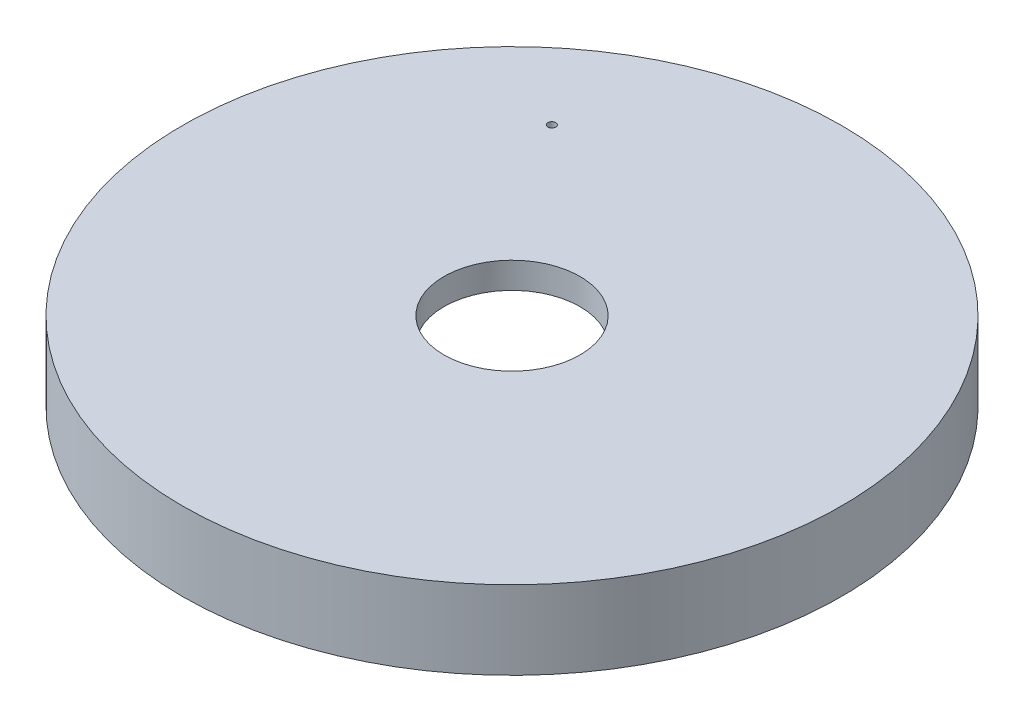
ISO-10303-21;
HEADER;
FILE_DESCRIPTION(('STEP AP214'),'2;1');
FILE_NAME('part.step','',(''),(''),'','','');
FILE_SCHEMA(('AUTOMOTIVE_DESIGN { 1 0 10303 214 1 1 1 1 }'));
ENDSEC;
DATA;
#1=APPLICATION_CONTEXT('core data for automotive mechanical design processes');
#2=APPLICATION_PROTOCOL_DEFINITION('international standard','automotive_design',2000,#1);
#3=PRODUCT_CONTEXT('',#1,'mechanical');
#4=PRODUCT('Part','Part','',(#3));
#5=PRODUCT_RELATED_PRODUCT_CATEGORY('part','',(#4));
#6=PRODUCT_DEFINITION_FORMATION('','',#4);
#7=PRODUCT_DEFINITION_CONTEXT('part definition',#1,'design');
#8=PRODUCT_DEFINITION('design','',#6,#7);
#9=PRODUCT_DEFINITION_SHAPE('','',#8);
#10=(LENGTH_UNIT() NAMED_UNIT(*) SI_UNIT(.MILLI.,.METRE.));
#11=(NAMED_UNIT(*) PLANE_ANGLE_UNIT() SI_UNIT($,.RADIAN.));
#12=(NAMED_UNIT(*) SI_UNIT($,.STERADIAN.) SOLID_ANGLE_UNIT());
#13=UNCERTAINTY_MEASURE_WITH_UNIT(LENGTH_MEASURE(1.E-05),#10,'distance_accuracy_value','');
#14=(GEOMETRIC_REPRESENTATION_CONTEXT(3) GLOBAL_UNCERTAINTY_ASSIGNED_CONTEXT((#13)) GLOBAL_UNIT_ASSIGNED_CONTEXT((#10,
#11,#12)) REPRESENTATION_CONTEXT('',''));
#15=CARTESIAN_POINT('',(0.,0.,0.));
#16=DIRECTION('',(0.,0.,1.));
#17=DIRECTION('',(1.,0.,0.));
#18=AXIS2_PLACEMENT_3D('',#15,#16,#17);
#19=CARTESIAN_POINT('',(0.,24.6083363009322,0.));
#20=DIRECTION('',(0.,1.,0.));
#21=DIRECTION('',(0.,0.,1.));
#22=AXIS2_PLACEMENT_3D('',#19,#20,#21);
#23=CYLINDRICAL_SURFACE('',#22,13.);
#24=CARTESIAN_POINT('',(0.,-2.5,0.));
#25=DIRECTION('',(0.,1.,0.));
#26=DIRECTION('',(0.,0.,1.));
#27=AXIS2_PLACEMENT_3D('',#24,#25,#26);
#28=CIRCLE('',#27,13.);
#29=CARTESIAN_POINT('',(0.,-2.5,-13.));
#30=VERTEX_POINT('',#29);
#31=EDGE_CURVE('E62',#30,#30,#28,.T.);
#32=ORIENTED_EDGE('',*,*,#31,.F.);
#33=EDGE_LOOP('',(#32));
#34=FACE_BOUND('',#33,.T.);
#35=CARTESIAN_POINT('',(0.,2.5,0.));
#36=DIRECTION('',(0.,1.,0.));
#37=DIRECTION('',(0.,0.,1.));
#38=AXIS2_PLACEMENT_3D('',#35,#36,#37);
#39=CIRCLE('',#38,13.);
#40=CARTESIAN_POINT('',(0.,2.5,13.));
#41=VERTEX_POINT('',#40);
#42=EDGE_CURVE('E10',#41,#41,#39,.T.);
#43=ORIENTED_EDGE('',*,*,#42,.T.);
#44=EDGE_LOOP('',(#43));
#45=FACE_BOUND('',#44,.T.);
#46=ADVANCED_FACE('F43',(#34,#45),#23,.F.);
#47=CARTESIAN_POINT('',(13.,2.5,0.));
#48=DIRECTION('',(0.,-1.,0.));
#49=DIRECTION('',(0.,0.,-1.));
#50=AXIS2_PLACEMENT_3D('',#47,#48,#49);
#51=PLANE('',#50);
#52=CARTESIAN_POINT('',(-27.7859608156295,2.5,-35.3968979086063));
#53=DIRECTION('',(0.,-1.,0.));
#54=DIRECTION('',(0.,0.,-1.));
#55=AXIS2_PLACEMENT_3D('',#52,#53,#54);
#56=CIRCLE('',#55,0.750000000000002);
#57=CARTESIAN_POINT('',(-27.7859608156295,2.5,-36.1468979086063));
#58=VERTEX_POINT('',#57);
#59=EDGE_CURVE('E65',#58,#58,#56,.T.);
#60=ORIENTED_EDGE('',*,*,#59,.T.);
#61=EDGE_LOOP('',(#60));
#62=FACE_BOUND('',#61,.T.);
#63=ORIENTED_EDGE('',*,*,#42,.F.);
#64=EDGE_LOOP('',(#63));
#65=FACE_BOUND('',#64,.T.);
#66=CARTESIAN_POINT('',(0.,2.5,0.));
#67=DIRECTION('',(0.,1.,0.));
#68=DIRECTION('',(0.,0.,1.));
#69=AXIS2_PLACEMENT_3D('',#66,#67,#68);
#70=CIRCLE('',#69,63.);
#71=CARTESIAN_POINT('',(0.,2.5,63.));
#72=VERTEX_POINT('',#71);
#73=EDGE_CURVE('E50',#72,#72,#70,.T.);
#74=ORIENTED_EDGE('',*,*,#73,.T.);
#75=EDGE_LOOP('',(#74));
#76=FACE_BOUND('',#75,.T.);
#77=ADVANCED_FACE('F87',(#62,#65,#76),#51,.F.);
#78=CARTESIAN_POINT('',(0.,24.6083363009322,0.));
#79=DIRECTION('',(0.,1.,0.));
#80=DIRECTION('',(0.,0.,1.));
#81=AXIS2_PLACEMENT_3D('',#78,#79,#80);
#82=CYLINDRICAL_SURFACE('',#81,63.);
#83=ORIENTED_EDGE('',*,*,#73,.F.);
#84=EDGE_LOOP('',(#83));
#85=FACE_BOUND('',#84,.T.);
#86=CARTESIAN_POINT('',(0.,-12.5,0.));
#87=DIRECTION('',(0.,1.,0.));
#88=DIRECTION('',(0.,0.,1.));
#89=AXIS2_PLACEMENT_3D('',#86,#87,#88);
#90=CIRCLE('',#89,63.);
#91=CARTESIAN_POINT('',(0.,-12.5,63.));
#92=VERTEX_POINT('',#91);
#93=EDGE_CURVE('E54',#92,#92,#90,.T.);
#94=ORIENTED_EDGE('',*,*,#93,.T.);
#95=EDGE_LOOP('',(#94));
#96=FACE_BOUND('',#95,.T.);
#97=ADVANCED_FACE('F92',(#85,#96),#82,.T.);
#98=CARTESIAN_POINT('',(63.,-12.5,0.));
#99=DIRECTION('',(0.,1.,0.));
#100=DIRECTION('',(0.,0.,1.));
#101=AXIS2_PLACEMENT_3D('',#98,#99,#100);
#102=PLANE('',#101);
#103=CARTESIAN_POINT('',(-27.7859608156295,-12.5,-35.3968979086063));
#104=DIRECTION('',(0.,1.,0.));
#105=DIRECTION('',(0.,0.,1.));
#106=AXIS2_PLACEMENT_3D('',#103,#104,#105);
#107=CIRCLE('',#106,0.750000000000002);
#108=CARTESIAN_POINT('',(-27.7859608156295,-12.5,-34.6468979086063));
#109=VERTEX_POINT('',#108);
#110=EDGE_CURVE('E46',#109,#109,#107,.T.);
#111=ORIENTED_EDGE('',*,*,#110,.T.);
#112=EDGE_LOOP('',(#111));
#113=FACE_BOUND('',#112,.T.);
#114=ORIENTED_EDGE('',*,*,#93,.F.);
#115=EDGE_LOOP('',(#114));
#116=FACE_BOUND('',#115,.T.);
#117=CARTESIAN_POINT('',(0.,-12.5,0.));
#118=DIRECTION('',(0.,1.,0.));
#119=DIRECTION('',(0.,0.,1.));
#120=AXIS2_PLACEMENT_3D('',#117,#118,#119);
#121=CIRCLE('',#120,40.4747741945462);
#122=CARTESIAN_POINT('',(0.,-12.5,-40.4747741945462));
#123=VERTEX_POINT('',#122);
#124=EDGE_CURVE('E59',#123,#123,#121,.T.);
#125=ORIENTED_EDGE('',*,*,#124,.T.);
#126=EDGE_LOOP('',(#125));
#127=FACE_BOUND('',#126,.T.);
#128=ADVANCED_FACE('F72',(#113,#116,#127),#102,.F.);
#129=CARTESIAN_POINT('',(0.,-2.5,0.));
#130=DIRECTION('',(0.,-1.,0.));
#131=DIRECTION('',(0.,0.,-1.));
#132=AXIS2_PLACEMENT_3D('',#129,#130,#131);
#133=CONICAL_SURFACE('',#132,13.,1.22173047639603);
#134=CARTESIAN_POINT('',(0.,-12.5,-40.4747741945462));
#135=CARTESIAN_POINT('',(0.,-12.3958333333333,-40.1885786300196));
#136=CARTESIAN_POINT('',(0.,-12.2916666666667,-39.9023830654931));
#137=CARTESIAN_POINT('',(0.,-12.0833333333333,-39.3299919364401));
#138=CARTESIAN_POINT('',(0.,-11.9791666666667,-39.0437963719136));
#139=CARTESIAN_POINT('',(0.,-11.7708333333333,-38.4714052428605));
#140=CARTESIAN_POINT('',(0.,-11.6666666666667,-38.185209678334));
#141=CARTESIAN_POINT('',(0.,-11.4583333333333,-37.6128185492809));
#142=CARTESIAN_POINT('',(0.,-11.3541666666667,-37.3266229847544));
#143=CARTESIAN_POINT('',(0.,-11.1458333333333,-36.7542318557014));
#144=CARTESIAN_POINT('',(0.,-11.0416666666667,-36.4680362911748));
#145=CARTESIAN_POINT('',(0.,-10.8333333333333,-35.8956451621218));
#146=CARTESIAN_POINT('',(0.,-10.7291666666667,-35.6094495975953));
#147=CARTESIAN_POINT('',(0.,-10.5208333333333,-35.0370584685422));
#148=CARTESIAN_POINT('',(0.,-10.4166666666667,-34.7508629040157));
#149=CARTESIAN_POINT('',(0.,-10.2083333333333,-34.1784717749627));
#150=CARTESIAN_POINT('',(0.,-10.1041666666667,-33.8922762104361));
#151=CARTESIAN_POINT('',(0.,-9.89583333333333,-33.3198850813831));
#152=CARTESIAN_POINT('',(0.,-9.79166666666667,-33.0336895168566));
#153=CARTESIAN_POINT('',(0.,-9.58333333333333,-32.4612983878035));
#154=CARTESIAN_POINT('',(0.,-9.47916666666667,-32.175102823277));
#155=CARTESIAN_POINT('',(0.,-9.27083333333333,-31.602711694224));
#156=CARTESIAN_POINT('',(0.,-9.16666666666667,-31.3165161296974));
#157=CARTESIAN_POINT('',(0.,-8.95833333333333,-30.7441250006444));
#158=CARTESIAN_POINT('',(0.,-8.85416666666667,-30.4579294361179));
#159=CARTESIAN_POINT('',(0.,-8.64583333333334,-29.8855383070648));
#160=CARTESIAN_POINT('',(0.,-8.54166666666667,-29.5993427425383));
#161=CARTESIAN_POINT('',(0.,-8.33333333333333,-29.0269516134853));
#162=CARTESIAN_POINT('',(0.,-8.22916666666667,-28.7407560489587));
#163=CARTESIAN_POINT('',(0.,-8.02083333333333,-28.1683649199057));
#164=CARTESIAN_POINT('',(0.,-7.91666666666667,-27.8821693553792));
#165=CARTESIAN_POINT('',(0.,-7.70833333333333,-27.3097782263261));
#166=CARTESIAN_POINT('',(0.,-7.60416666666667,-27.0235826617996));
#167=CARTESIAN_POINT('',(0.,-7.39583333333333,-26.4511915327466));
#168=CARTESIAN_POINT('',(0.,-7.29166666666667,-26.16499596822));
#169=CARTESIAN_POINT('',(0.,-7.08333333333333,-25.592604839167));
#170=CARTESIAN_POINT('',(0.,-6.97916666666667,-25.3064092746405));
#171=CARTESIAN_POINT('',(0.,-6.77083333333333,-24.7340181455874));
#172=CARTESIAN_POINT('',(0.,-6.66666666666667,-24.4478225810609));
#173=CARTESIAN_POINT('',(0.,-6.45833333333333,-23.8754314520079));
#174=CARTESIAN_POINT('',(0.,-6.35416666666667,-23.5892358874813));
#175=CARTESIAN_POINT('',(0.,-6.14583333333333,-23.0168447584283));
#176=CARTESIAN_POINT('',(0.,-6.04166666666667,-22.7306491939018));
#177=CARTESIAN_POINT('',(0.,-5.83333333333333,-22.1582580648487));
#178=CARTESIAN_POINT('',(0.,-5.72916666666667,-21.8720625003222));
#179=CARTESIAN_POINT('',(0.,-5.52083333333333,-21.2996713712692));
#180=CARTESIAN_POINT('',(0.,-5.41666666666667,-21.0134758067426));
#181=CARTESIAN_POINT('',(0.,-5.20833333333333,-20.4410846776896));
#182=CARTESIAN_POINT('',(0.,-5.10416666666667,-20.1548891131631));
#183=CARTESIAN_POINT('',(0.,-4.89583333333333,-19.58249798411));
#184=CARTESIAN_POINT('',(0.,-4.79166666666667,-19.2963024195835));
#185=CARTESIAN_POINT('',(0.,-4.58333333333333,-18.7239112905305));
#186=CARTESIAN_POINT('',(0.,-4.47916666666667,-18.4377157260039));
#187=CARTESIAN_POINT('',(0.,-4.27083333333333,-17.8653245969509));
#188=CARTESIAN_POINT('',(0.,-4.16666666666667,-17.5791290324244));
#189=CARTESIAN_POINT('',(0.,-3.95833333333333,-17.0067379033713));
#190=CARTESIAN_POINT('',(0.,-3.85416666666667,-16.7205423388448));
#191=CARTESIAN_POINT('',(0.,-3.64583333333333,-16.1481512097918));
#192=CARTESIAN_POINT('',(0.,-3.54166666666667,-15.8619556452652));
#193=CARTESIAN_POINT('',(0.,-3.33333333333333,-15.2895645162122));
#194=CARTESIAN_POINT('',(0.,-3.22916666666667,-15.0033689516857));
#195=CARTESIAN_POINT('',(0.,-3.02083333333333,-14.4309778226326));
#196=CARTESIAN_POINT('',(0.,-2.91666666666667,-14.1447822581061));
#197=CARTESIAN_POINT('',(0.,-2.70833333333333,-13.572391129053));
#198=CARTESIAN_POINT('',(0.,-2.60416666666667,-13.2861955645265));
#199=CARTESIAN_POINT('',(0.,-2.5,-13.));
#200=B_SPLINE_CURVE_WITH_KNOTS('',3,(#134,#135,#136,#137,#138,#139,#140,#141,#142,#143,#144,
#145,#146,#147,#148,#149,#150,#151,#152,#153,#154,#155,#156,#157,#158,#159,#160,#161,#162,#163,
#164,#165,#166,#167,#168,#169,#170,#171,#172,#173,#174,#175,#176,#177,#178,#179,#180,#181,#182,
#183,#184,#185,#186,#187,#188,#189,#190,#191,#192,#193,#194,#195,#196,#197,#198,#199),
.UNSPECIFIED.,.F.,.F.,(4,2,2,2,2,2,2,2,2,2,2,2,2,2,2,2,2,2,2,2,2,2,2,2,2,2,2,2,2,2,2,2,4),(0.,
0.913688875050966,1.82737775010193,2.74106662515289,3.65475550020386,4.56844437525481,
5.48213325030578,6.39582212535675,7.30951100040771,8.22319987545867,9.13688875050964,
10.0505776255606,10.9642665006116,11.8779553756625,12.7916442507135,13.7053331257644,
14.6190220008154,15.5327108758664,16.4463997509173,17.3600886259683,18.2737775010193,
19.1874663760702,20.1011552511212,21.0148441261721,21.9285330012231,22.8422218762741,
23.755910751325,24.669599626376,25.583288501427,26.4969773764779,27.4106662515289,
28.3243551265798,29.2380440016308),.UNSPECIFIED.);
#201=EDGE_CURVE('BSEAM78',#123,#30,#200,.T.);
#202=ORIENTED_EDGE('',*,*,#124,.F.);
#203=ORIENTED_EDGE('',*,*,#31,.T.);
#204=ORIENTED_EDGE('',*,*,#201,.T.);
#205=ORIENTED_EDGE('',*,*,#201,.F.);
#206=EDGE_LOOP('',(#202,#204,#203,#205));
#207=FACE_BOUND('',#206,.T.);
#208=ADVANCED_FACE('F78',(#207),#133,.F.);
#209=CARTESIAN_POINT('',(-27.7859608156295,-15.,-35.3968979086063));
#210=DIRECTION('',(0.,1.,0.));
#211=DIRECTION('',(0.,0.,1.));
#212=AXIS2_PLACEMENT_3D('',#209,#210,#211);
#213=CYLINDRICAL_SURFACE('',#212,0.750000000000002);
#214=ORIENTED_EDGE('',*,*,#110,.F.);
#215=EDGE_LOOP('',(#214));
#216=FACE_BOUND('',#215,.T.);
#217=ORIENTED_EDGE('',*,*,#59,.F.);
#218=EDGE_LOOP('',(#217));
#219=FACE_BOUND('',#218,.T.);
#220=ADVANCED_FACE('F75',(#216,#219),#213,.F.);
#221=CLOSED_SHELL('',(#46,#77,#97,#128,#208,#220));
#222=MANIFOLD_SOLID_BREP('B2',#221);
#223=ADVANCED_BREP_SHAPE_REPRESENTATION('',(#18,#222),#14);
#224=SHAPE_DEFINITION_REPRESENTATION(#9,#223);
ENDSEC;
END-ISO-10303-21;
